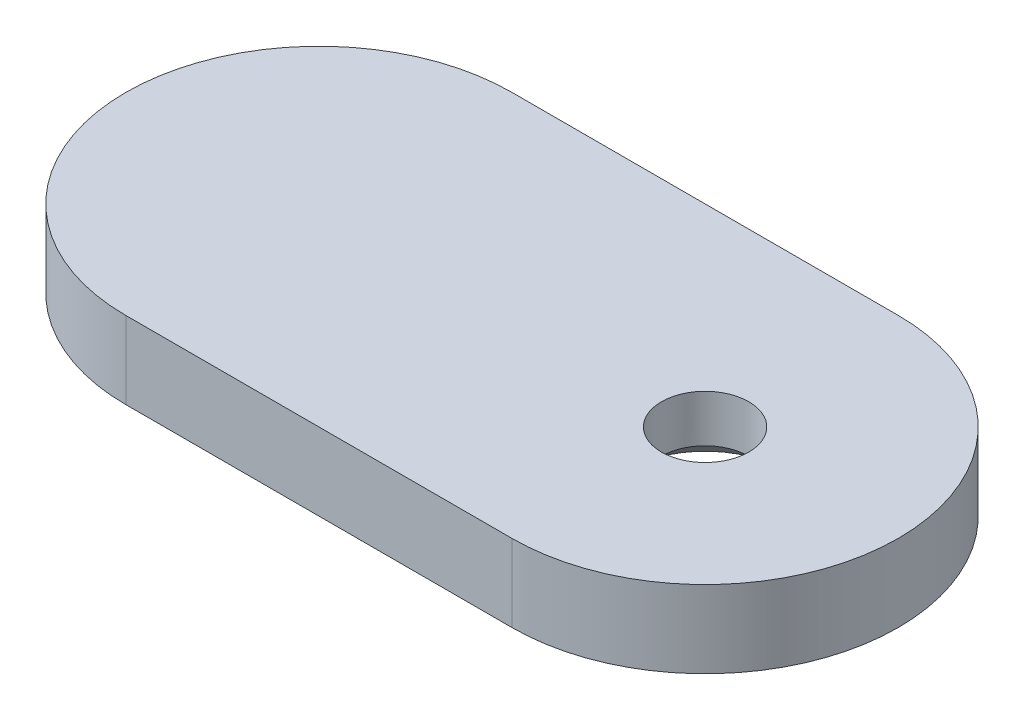
ISO-10303-21;
HEADER;
FILE_DESCRIPTION(('STEP AP214'),'2;1');
FILE_NAME('part.step','',(''),(''),'','','');
FILE_SCHEMA(('AUTOMOTIVE_DESIGN { 1 0 10303 214 1 1 1 1 }'));
ENDSEC;
DATA;
#1=APPLICATION_CONTEXT('core data for automotive mechanical design processes');
#2=APPLICATION_PROTOCOL_DEFINITION('international standard','automotive_design',2000,#1);
#3=PRODUCT_CONTEXT('',#1,'mechanical');
#4=PRODUCT('Part','Part','',(#3));
#5=PRODUCT_RELATED_PRODUCT_CATEGORY('part','',(#4));
#6=PRODUCT_DEFINITION_FORMATION('','',#4);
#7=PRODUCT_DEFINITION_CONTEXT('part definition',#1,'design');
#8=PRODUCT_DEFINITION('design','',#6,#7);
#9=PRODUCT_DEFINITION_SHAPE('','',#8);
#10=(LENGTH_UNIT() NAMED_UNIT(*) SI_UNIT(.MILLI.,.METRE.));
#11=(NAMED_UNIT(*) PLANE_ANGLE_UNIT() SI_UNIT($,.RADIAN.));
#12=(NAMED_UNIT(*) SI_UNIT($,.STERADIAN.) SOLID_ANGLE_UNIT());
#13=UNCERTAINTY_MEASURE_WITH_UNIT(LENGTH_MEASURE(1.E-05),#10,'distance_accuracy_value','');
#14=(GEOMETRIC_REPRESENTATION_CONTEXT(3) GLOBAL_UNCERTAINTY_ASSIGNED_CONTEXT((#13)) GLOBAL_UNIT_ASSIGNED_CONTEXT((#10,
#11,#12)) REPRESENTATION_CONTEXT('',''));
#15=CARTESIAN_POINT('',(0.,0.,0.));
#16=DIRECTION('',(0.,0.,1.));
#17=DIRECTION('',(1.,0.,0.));
#18=AXIS2_PLACEMENT_3D('',#15,#16,#17);
#19=CARTESIAN_POINT('',(-6.92075426384892,2.,0.));
#20=DIRECTION('',(0.,-1.,0.));
#21=DIRECTION('',(0.,0.,-1.));
#22=AXIS2_PLACEMENT_3D('',#19,#20,#21);
#23=CYLINDRICAL_SURFACE('',#22,5.);
#24=CARTESIAN_POINT('',(-6.92075426384892,0.,0.));
#25=DIRECTION('',(0.,1.,0.));
#26=DIRECTION('',(0.,0.,1.));
#27=AXIS2_PLACEMENT_3D('',#24,#25,#26);
#28=CIRCLE('',#27,5.);
#29=CARTESIAN_POINT('',(-6.92075426384892,0.,-5.));
#30=VERTEX_POINT('',#29);
#31=CARTESIAN_POINT('',(-6.92075426384892,0.,5.));
#32=VERTEX_POINT('',#31);
#33=EDGE_CURVE('E101',#30,#32,#28,.T.);
#34=ORIENTED_EDGE('',*,*,#33,.T.);
#35=DIRECTION('',(0.,-1.,0.));
#36=VECTOR('',#35,1.);
#37=CARTESIAN_POINT('',(-6.92075426384892,2.,5.));
#38=LINE('',#37,#36);
#39=CARTESIAN_POINT('',(-6.92075426384892,2.,5.));
#40=VERTEX_POINT('',#39);
#41=EDGE_CURVE('E11',#40,#32,#38,.T.);
#42=ORIENTED_EDGE('',*,*,#41,.F.);
#43=CARTESIAN_POINT('',(-6.92075426384892,2.,0.));
#44=DIRECTION('',(0.,1.,0.));
#45=DIRECTION('',(0.,0.,1.));
#46=AXIS2_PLACEMENT_3D('',#43,#44,#45);
#47=CIRCLE('',#46,5.);
#48=CARTESIAN_POINT('',(-6.92075426384892,2.,-5.));
#49=VERTEX_POINT('',#48);
#50=EDGE_CURVE('E88',#49,#40,#47,.T.);
#51=ORIENTED_EDGE('',*,*,#50,.F.);
#52=DIRECTION('',(0.,-1.,0.));
#53=VECTOR('',#52,1.);
#54=CARTESIAN_POINT('',(-6.92075426384892,2.,-5.));
#55=LINE('',#54,#53);
#56=EDGE_CURVE('E97',#49,#30,#55,.T.);
#57=ORIENTED_EDGE('',*,*,#56,.T.);
#58=EDGE_LOOP('',(#34,#42,#51,#57));
#59=FACE_BOUND('',#58,.T.);
#60=ADVANCED_FACE('F36',(#59),#23,.T.);
#61=CARTESIAN_POINT('',(-6.92075426384892,2.,5.));
#62=DIRECTION('',(0.,0.,-1.));
#63=DIRECTION('',(-1.,0.,0.));
#64=AXIS2_PLACEMENT_3D('',#61,#62,#63);
#65=PLANE('',#64);
#66=DIRECTION('',(1.,0.,0.));
#67=VECTOR('',#66,1.);
#68=CARTESIAN_POINT('',(-6.92075426384892,0.,5.));
#69=LINE('',#68,#67);
#70=CARTESIAN_POINT('',(3.07924573615108,0.,5.));
#71=VERTEX_POINT('',#70);
#72=EDGE_CURVE('E92',#32,#71,#69,.T.);
#73=ORIENTED_EDGE('',*,*,#72,.T.);
#74=DIRECTION('',(0.,-1.,0.));
#75=VECTOR('',#74,1.);
#76=CARTESIAN_POINT('',(3.07924573615108,2.,5.));
#77=LINE('',#76,#75);
#78=CARTESIAN_POINT('',(3.07924573615108,2.,5.));
#79=VERTEX_POINT('',#78);
#80=EDGE_CURVE('E45',#79,#71,#77,.T.);
#81=ORIENTED_EDGE('',*,*,#80,.F.);
#82=DIRECTION('',(1.,0.,0.));
#83=VECTOR('',#82,1.);
#84=CARTESIAN_POINT('',(-6.92075426384892,2.,5.));
#85=LINE('',#84,#83);
#86=EDGE_CURVE('E83',#40,#79,#85,.T.);
#87=ORIENTED_EDGE('',*,*,#86,.F.);
#88=ORIENTED_EDGE('',*,*,#41,.T.);
#89=EDGE_LOOP('',(#73,#81,#87,#88));
#90=FACE_BOUND('',#89,.T.);
#91=ADVANCED_FACE('F91',(#90),#65,.F.);
#92=CARTESIAN_POINT('',(3.07924573615108,2.,0.));
#93=DIRECTION('',(0.,-1.,0.));
#94=DIRECTION('',(0.,0.,-1.));
#95=AXIS2_PLACEMENT_3D('',#92,#93,#94);
#96=CYLINDRICAL_SURFACE('',#95,5.);
#97=CARTESIAN_POINT('',(3.07924573615108,0.,0.));
#98=DIRECTION('',(0.,1.,0.));
#99=DIRECTION('',(0.,0.,1.));
#100=AXIS2_PLACEMENT_3D('',#97,#98,#99);
#101=CIRCLE('',#100,5.);
#102=CARTESIAN_POINT('',(3.07924573615108,0.,-5.));
#103=VERTEX_POINT('',#102);
#104=EDGE_CURVE('E70',#71,#103,#101,.T.);
#105=ORIENTED_EDGE('',*,*,#104,.T.);
#106=DIRECTION('',(0.,-1.,0.));
#107=VECTOR('',#106,1.);
#108=CARTESIAN_POINT('',(3.07924573615108,2.,-5.));
#109=LINE('',#108,#107);
#110=CARTESIAN_POINT('',(3.07924573615108,2.,-5.));
#111=VERTEX_POINT('',#110);
#112=EDGE_CURVE('E93',#111,#103,#109,.T.);
#113=ORIENTED_EDGE('',*,*,#112,.F.);
#114=CARTESIAN_POINT('',(3.07924573615108,2.,0.));
#115=DIRECTION('',(0.,1.,0.));
#116=DIRECTION('',(0.,0.,1.));
#117=AXIS2_PLACEMENT_3D('',#114,#115,#116);
#118=CIRCLE('',#117,5.);
#119=EDGE_CURVE('E86',#79,#111,#118,.T.);
#120=ORIENTED_EDGE('',*,*,#119,.F.);
#121=ORIENTED_EDGE('',*,*,#80,.T.);
#122=EDGE_LOOP('',(#105,#113,#120,#121));
#123=FACE_BOUND('',#122,.T.);
#124=ADVANCED_FACE('F95',(#123),#96,.T.);
#125=CARTESIAN_POINT('',(-6.92075426384892,2.,-5.));
#126=DIRECTION('',(0.,0.,1.));
#127=DIRECTION('',(1.,0.,0.));
#128=AXIS2_PLACEMENT_3D('',#125,#126,#127);
#129=PLANE('',#128);
#130=DIRECTION('',(-1.,0.,0.));
#131=VECTOR('',#130,1.);
#132=CARTESIAN_POINT('',(-6.92075426384892,0.,-5.));
#133=LINE('',#132,#131);
#134=EDGE_CURVE('E76',#103,#30,#133,.T.);
#135=ORIENTED_EDGE('',*,*,#134,.T.);
#136=ORIENTED_EDGE('',*,*,#56,.F.);
#137=DIRECTION('',(-1.,0.,0.));
#138=VECTOR('',#137,1.);
#139=CARTESIAN_POINT('',(-6.92075426384892,2.,-5.));
#140=LINE('',#139,#138);
#141=EDGE_CURVE('E53',#111,#49,#140,.T.);
#142=ORIENTED_EDGE('',*,*,#141,.F.);
#143=ORIENTED_EDGE('',*,*,#112,.T.);
#144=EDGE_LOOP('',(#135,#136,#142,#143));
#145=FACE_BOUND('',#144,.T.);
#146=ADVANCED_FACE('F108',(#145),#129,.F.);
#147=CARTESIAN_POINT('',(-6.92075426384892,2.,0.));
#148=DIRECTION('',(0.,1.,0.));
#149=DIRECTION('',(0.,0.,1.));
#150=AXIS2_PLACEMENT_3D('',#147,#148,#149);
#151=PLANE('',#150);
#152=CARTESIAN_POINT('',(3.07924573615109,2.,0.));
#153=DIRECTION('',(0.,1.,0.));
#154=DIRECTION('',(0.,0.,1.));
#155=AXIS2_PLACEMENT_3D('',#152,#153,#154);
#156=CIRCLE('',#155,1.13029999999999);
#157=CARTESIAN_POINT('',(3.07924573615109,2.,1.13029999999999));
#158=VERTEX_POINT('',#157);
#159=EDGE_CURVE('E39',#158,#158,#156,.T.);
#160=ORIENTED_EDGE('',*,*,#159,.F.);
#161=EDGE_LOOP('',(#160));
#162=FACE_BOUND('',#161,.T.);
#163=ORIENTED_EDGE('',*,*,#50,.T.);
#164=ORIENTED_EDGE('',*,*,#86,.T.);
#165=ORIENTED_EDGE('',*,*,#119,.T.);
#166=ORIENTED_EDGE('',*,*,#141,.T.);
#167=EDGE_LOOP('',(#163,#164,#165,#166));
#168=FACE_BOUND('',#167,.T.);
#169=ADVANCED_FACE('F84',(#162,#168),#151,.T.);
#170=CARTESIAN_POINT('',(-6.92075426384892,0.,0.));
#171=DIRECTION('',(0.,1.,0.));
#172=DIRECTION('',(0.,0.,1.));
#173=AXIS2_PLACEMENT_3D('',#170,#171,#172);
#174=PLANE('',#173);
#175=CARTESIAN_POINT('',(3.07924573615109,0.,0.));
#176=DIRECTION('',(0.,-1.,0.));
#177=DIRECTION('',(0.,0.,-1.));
#178=AXIS2_PLACEMENT_3D('',#175,#176,#177);
#179=CIRCLE('',#178,2.0574);
#180=CARTESIAN_POINT('',(3.07924573615109,0.,-2.0574));
#181=VERTEX_POINT('',#180);
#182=EDGE_CURVE('E117',#181,#181,#179,.T.);
#183=ORIENTED_EDGE('',*,*,#182,.F.);
#184=EDGE_LOOP('',(#183));
#185=FACE_BOUND('',#184,.T.);
#186=ORIENTED_EDGE('',*,*,#33,.F.);
#187=ORIENTED_EDGE('',*,*,#134,.F.);
#188=ORIENTED_EDGE('',*,*,#104,.F.);
#189=ORIENTED_EDGE('',*,*,#72,.F.);
#190=EDGE_LOOP('',(#186,#187,#188,#189));
#191=FACE_BOUND('',#190,.T.);
#192=ADVANCED_FACE('F111',(#185,#191),#174,.F.);
#193=CARTESIAN_POINT('',(3.07924573615109,0.,0.));
#194=DIRECTION('',(0.,-1.,0.));
#195=DIRECTION('',(0.,0.,-1.));
#196=AXIS2_PLACEMENT_3D('',#193,#194,#195);
#197=CYLINDRICAL_SURFACE('',#196,1.13029999999999);
#198=ORIENTED_EDGE('',*,*,#159,.T.);
#199=EDGE_LOOP('',(#198));
#200=FACE_BOUND('',#199,.T.);
#201=CARTESIAN_POINT('',(3.07924573615109,0.77792926806447,0.));
#202=DIRECTION('',(0.,-1.,0.));
#203=DIRECTION('',(0.,0.,-1.));
#204=AXIS2_PLACEMENT_3D('',#201,#202,#203);
#205=CIRCLE('',#204,1.13029999999999);
#206=CARTESIAN_POINT('',(3.07924573615109,0.77792926806447,-1.13029999999999));
#207=VERTEX_POINT('',#206);
#208=EDGE_CURVE('E114',#207,#207,#205,.T.);
#209=ORIENTED_EDGE('',*,*,#208,.T.);
#210=EDGE_LOOP('',(#209));
#211=FACE_BOUND('',#210,.T.);
#212=ADVANCED_FACE('F124',(#200,#211),#197,.F.);
#213=CARTESIAN_POINT('',(3.07924573615109,0.,0.));
#214=DIRECTION('',(0.,-1.,0.));
#215=DIRECTION('',(0.,0.,-1.));
#216=AXIS2_PLACEMENT_3D('',#213,#214,#215);
#217=CONICAL_SURFACE('',#216,2.0574,0.872664625997162);
#218=ORIENTED_EDGE('',*,*,#208,.F.);
#219=EDGE_LOOP('',(#218));
#220=FACE_BOUND('',#219,.T.);
#221=ORIENTED_EDGE('',*,*,#182,.T.);
#222=EDGE_LOOP('',(#221));
#223=FACE_BOUND('',#222,.T.);
#224=ADVANCED_FACE('F121',(#220,#223),#217,.F.);
#225=CLOSED_SHELL('',(#60,#91,#124,#146,#169,#192,#212,#224));
#226=MANIFOLD_SOLID_BREP('B2',#225);
#227=ADVANCED_BREP_SHAPE_REPRESENTATION('',(#18,#226),#14);
#228=SHAPE_DEFINITION_REPRESENTATION(#9,#227);
ENDSEC;
END-ISO-10303-21;
